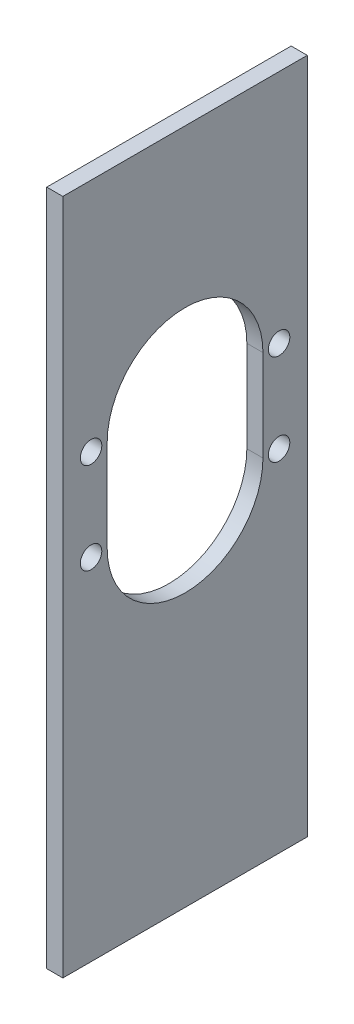
ISO-10303-21;
HEADER;
FILE_DESCRIPTION(('STEP AP214'),'2;1');
FILE_NAME('part.step','',(''),(''),'','','');
FILE_SCHEMA(('AUTOMOTIVE_DESIGN { 1 0 10303 214 1 1 1 1 }'));
ENDSEC;
DATA;
#1=APPLICATION_CONTEXT('core data for automotive mechanical design processes');
#2=APPLICATION_PROTOCOL_DEFINITION('international standard','automotive_design',2000,#1);
#3=PRODUCT_CONTEXT('',#1,'mechanical');
#4=PRODUCT('Part','Part','',(#3));
#5=PRODUCT_RELATED_PRODUCT_CATEGORY('part','',(#4));
#6=PRODUCT_DEFINITION_FORMATION('','',#4);
#7=PRODUCT_DEFINITION_CONTEXT('part definition',#1,'design');
#8=PRODUCT_DEFINITION('design','',#6,#7);
#9=PRODUCT_DEFINITION_SHAPE('','',#8);
#10=(LENGTH_UNIT() NAMED_UNIT(*) SI_UNIT(.MILLI.,.METRE.));
#11=(NAMED_UNIT(*) PLANE_ANGLE_UNIT() SI_UNIT($,.RADIAN.));
#12=(NAMED_UNIT(*) SI_UNIT($,.STERADIAN.) SOLID_ANGLE_UNIT());
#13=UNCERTAINTY_MEASURE_WITH_UNIT(LENGTH_MEASURE(1.E-05),#10,'distance_accuracy_value','');
#14=(GEOMETRIC_REPRESENTATION_CONTEXT(3) GLOBAL_UNCERTAINTY_ASSIGNED_CONTEXT((#13)) GLOBAL_UNIT_ASSIGNED_CONTEXT((#10,
#11,#12)) REPRESENTATION_CONTEXT('',''));
#15=CARTESIAN_POINT('',(0.,0.,0.));
#16=DIRECTION('',(0.,0.,1.));
#17=DIRECTION('',(1.,0.,0.));
#18=AXIS2_PLACEMENT_3D('',#15,#16,#17);
#19=CARTESIAN_POINT('',(3.,0.,0.));
#20=DIRECTION('',(1.,0.,0.));
#21=DIRECTION('',(0.,0.,-1.));
#22=AXIS2_PLACEMENT_3D('',#19,#20,#21);
#23=PLANE('',#22);
#24=CARTESIAN_POINT('',(3.,-43.8,-40.25));
#25=DIRECTION('',(1.,0.,0.));
#26=DIRECTION('',(0.,0.,1.));
#27=AXIS2_PLACEMENT_3D('',#24,#25,#26);
#28=CIRCLE('',#27,2.);
#29=CARTESIAN_POINT('',(3.,-43.8,-38.25));
#30=VERTEX_POINT('',#29);
#31=EDGE_CURVE('E161',#30,#30,#28,.T.);
#32=ORIENTED_EDGE('',*,*,#31,.F.);
#33=EDGE_LOOP('',(#32));
#34=FACE_BOUND('',#33,.T.);
#35=CARTESIAN_POINT('',(3.,-60.8,-5.25));
#36=DIRECTION('',(1.,0.,0.));
#37=DIRECTION('',(0.,0.,-1.));
#38=AXIS2_PLACEMENT_3D('',#35,#36,#37);
#39=CIRCLE('',#38,2.);
#40=CARTESIAN_POINT('',(3.,-60.8,-7.25));
#41=VERTEX_POINT('',#40);
#42=EDGE_CURVE('E177',#41,#41,#39,.T.);
#43=ORIENTED_EDGE('',*,*,#42,.F.);
#44=EDGE_LOOP('',(#43));
#45=FACE_BOUND('',#44,.T.);
#46=DIRECTION('',(0.,-1.,0.));
#47=VECTOR('',#46,1.);
#48=CARTESIAN_POINT('',(3.,0.,0.));
#49=LINE('',#48,#47);
#50=CARTESIAN_POINT('',(3.,0.,0.));
#51=VERTEX_POINT('',#50);
#52=CARTESIAN_POINT('',(3.,-126.,0.));
#53=VERTEX_POINT('',#52);
#54=EDGE_CURVE('E185',#51,#53,#49,.T.);
#55=ORIENTED_EDGE('',*,*,#54,.T.);
#56=DIRECTION('',(0.,0.,-1.));
#57=VECTOR('',#56,1.);
#58=CARTESIAN_POINT('',(3.,-126.,0.));
#59=LINE('',#58,#57);
#60=CARTESIAN_POINT('',(3.,-126.,-45.5));
#61=VERTEX_POINT('',#60);
#62=EDGE_CURVE('E189',#53,#61,#59,.T.);
#63=ORIENTED_EDGE('',*,*,#62,.T.);
#64=DIRECTION('',(0.,1.,0.));
#65=VECTOR('',#64,1.);
#66=CARTESIAN_POINT('',(3.,0.,-45.5));
#67=LINE('',#66,#65);
#68=CARTESIAN_POINT('',(3.,0.,-45.5));
#69=VERTEX_POINT('',#68);
#70=EDGE_CURVE('E193',#61,#69,#67,.T.);
#71=ORIENTED_EDGE('',*,*,#70,.T.);
#72=DIRECTION('',(0.,0.,1.));
#73=VECTOR('',#72,1.);
#74=CARTESIAN_POINT('',(3.,0.,0.));
#75=LINE('',#74,#73);
#76=EDGE_CURVE('E196',#69,#51,#75,.T.);
#77=ORIENTED_EDGE('',*,*,#76,.T.);
#78=EDGE_LOOP('',(#55,#63,#71,#77));
#79=FACE_BOUND('',#78,.T.);
#80=CARTESIAN_POINT('',(3.,-60.8,-40.25));
#81=DIRECTION('',(1.,0.,0.));
#82=DIRECTION('',(0.,0.,-1.));
#83=AXIS2_PLACEMENT_3D('',#80,#81,#82);
#84=CIRCLE('',#83,2.);
#85=CARTESIAN_POINT('',(3.,-60.8,-42.25));
#86=VERTEX_POINT('',#85);
#87=EDGE_CURVE('E169',#86,#86,#84,.T.);
#88=ORIENTED_EDGE('',*,*,#87,.F.);
#89=EDGE_LOOP('',(#88));
#90=FACE_BOUND('',#89,.T.);
#91=CARTESIAN_POINT('',(3.,-43.8,-5.25));
#92=DIRECTION('',(1.,0.,0.));
#93=DIRECTION('',(0.,0.,1.));
#94=AXIS2_PLACEMENT_3D('',#91,#92,#93);
#95=CIRCLE('',#94,2.);
#96=CARTESIAN_POINT('',(3.,-43.8,-3.25));
#97=VERTEX_POINT('',#96);
#98=EDGE_CURVE('E153',#97,#97,#95,.T.);
#99=ORIENTED_EDGE('',*,*,#98,.F.);
#100=EDGE_LOOP('',(#99));
#101=FACE_BOUND('',#100,.T.);
#102=DIRECTION('',(0.,1.,0.));
#103=VECTOR('',#102,1.);
#104=CARTESIAN_POINT('',(3.,-60.8,-37.25));
#105=LINE('',#104,#103);
#106=CARTESIAN_POINT('',(3.,-60.8,-37.25));
#107=VERTEX_POINT('',#106);
#108=CARTESIAN_POINT('',(3.,-43.8,-37.25));
#109=VERTEX_POINT('',#108);
#110=EDGE_CURVE('E114',#107,#109,#105,.T.);
#111=ORIENTED_EDGE('',*,*,#110,.F.);
#112=CARTESIAN_POINT('',(3.,-60.8,-22.75));
#113=DIRECTION('',(1.,0.,0.));
#114=DIRECTION('',(0.,0.,1.));
#115=AXIS2_PLACEMENT_3D('',#112,#113,#114);
#116=CIRCLE('',#115,14.5);
#117=CARTESIAN_POINT('',(3.,-60.8,-8.25));
#118=VERTEX_POINT('',#117);
#119=EDGE_CURVE('E105',#118,#107,#116,.T.);
#120=ORIENTED_EDGE('',*,*,#119,.F.);
#121=DIRECTION('',(0.,-1.,0.));
#122=VECTOR('',#121,1.);
#123=CARTESIAN_POINT('',(3.,-60.8,-8.25));
#124=LINE('',#123,#122);
#125=CARTESIAN_POINT('',(3.,-43.8,-8.25));
#126=VERTEX_POINT('',#125);
#127=EDGE_CURVE('E131',#126,#118,#124,.T.);
#128=ORIENTED_EDGE('',*,*,#127,.F.);
#129=CARTESIAN_POINT('',(3.,-43.8,-22.75));
#130=DIRECTION('',(1.,0.,0.));
#131=DIRECTION('',(0.,0.,-1.));
#132=AXIS2_PLACEMENT_3D('',#129,#130,#131);
#133=CIRCLE('',#132,14.5);
#134=EDGE_CURVE('E127',#109,#126,#133,.T.);
#135=ORIENTED_EDGE('',*,*,#134,.F.);
#136=EDGE_LOOP('',(#111,#120,#128,#135));
#137=FACE_BOUND('',#136,.T.);
#138=ADVANCED_FACE('F39',(#34,#45,#79,#90,#101,#137),#23,.T.);
#139=CARTESIAN_POINT('',(0.,0.,0.));
#140=DIRECTION('',(1.,0.,0.));
#141=DIRECTION('',(0.,0.,-1.));
#142=AXIS2_PLACEMENT_3D('',#139,#140,#141);
#143=PLANE('',#142);
#144=CARTESIAN_POINT('',(0.,-43.8,-5.25));
#145=DIRECTION('',(1.,0.,0.));
#146=DIRECTION('',(0.,0.,1.));
#147=AXIS2_PLACEMENT_3D('',#144,#145,#146);
#148=CIRCLE('',#147,2.);
#149=CARTESIAN_POINT('',(0.,-43.8,-3.25));
#150=VERTEX_POINT('',#149);
#151=EDGE_CURVE('E123',#150,#150,#148,.T.);
#152=ORIENTED_EDGE('',*,*,#151,.T.);
#153=EDGE_LOOP('',(#152));
#154=FACE_BOUND('',#153,.T.);
#155=CARTESIAN_POINT('',(0.,-43.8,-40.25));
#156=DIRECTION('',(1.,0.,0.));
#157=DIRECTION('',(0.,0.,1.));
#158=AXIS2_PLACEMENT_3D('',#155,#156,#157);
#159=CIRCLE('',#158,2.);
#160=CARTESIAN_POINT('',(0.,-43.8,-38.25));
#161=VERTEX_POINT('',#160);
#162=EDGE_CURVE('E157',#161,#161,#159,.T.);
#163=ORIENTED_EDGE('',*,*,#162,.T.);
#164=EDGE_LOOP('',(#163));
#165=FACE_BOUND('',#164,.T.);
#166=CARTESIAN_POINT('',(0.,-60.8,-40.25));
#167=DIRECTION('',(1.,0.,0.));
#168=DIRECTION('',(0.,0.,-1.));
#169=AXIS2_PLACEMENT_3D('',#166,#167,#168);
#170=CIRCLE('',#169,2.);
#171=CARTESIAN_POINT('',(0.,-60.8,-42.25));
#172=VERTEX_POINT('',#171);
#173=EDGE_CURVE('E165',#172,#172,#170,.T.);
#174=ORIENTED_EDGE('',*,*,#173,.T.);
#175=EDGE_LOOP('',(#174));
#176=FACE_BOUND('',#175,.T.);
#177=CARTESIAN_POINT('',(0.,-60.8,-5.25));
#178=DIRECTION('',(1.,0.,0.));
#179=DIRECTION('',(0.,0.,-1.));
#180=AXIS2_PLACEMENT_3D('',#177,#178,#179);
#181=CIRCLE('',#180,2.);
#182=CARTESIAN_POINT('',(0.,-60.8,-7.25));
#183=VERTEX_POINT('',#182);
#184=EDGE_CURVE('E173',#183,#183,#181,.T.);
#185=ORIENTED_EDGE('',*,*,#184,.T.);
#186=EDGE_LOOP('',(#185));
#187=FACE_BOUND('',#186,.T.);
#188=DIRECTION('',(0.,-1.,0.));
#189=VECTOR('',#188,1.);
#190=CARTESIAN_POINT('',(0.,0.,0.));
#191=LINE('',#190,#189);
#192=CARTESIAN_POINT('',(0.,0.,0.));
#193=VERTEX_POINT('',#192);
#194=CARTESIAN_POINT('',(0.,-126.,0.));
#195=VERTEX_POINT('',#194);
#196=EDGE_CURVE('E181',#193,#195,#191,.T.);
#197=ORIENTED_EDGE('',*,*,#196,.F.);
#198=DIRECTION('',(0.,0.,1.));
#199=VECTOR('',#198,1.);
#200=CARTESIAN_POINT('',(0.,0.,0.));
#201=LINE('',#200,#199);
#202=CARTESIAN_POINT('',(0.,0.,-45.5));
#203=VERTEX_POINT('',#202);
#204=EDGE_CURVE('E190',#203,#193,#201,.T.);
#205=ORIENTED_EDGE('',*,*,#204,.F.);
#206=DIRECTION('',(0.,1.,0.));
#207=VECTOR('',#206,1.);
#208=CARTESIAN_POINT('',(0.,0.,-45.5));
#209=LINE('',#208,#207);
#210=CARTESIAN_POINT('',(0.,-126.,-45.5));
#211=VERTEX_POINT('',#210);
#212=EDGE_CURVE('E206',#211,#203,#209,.T.);
#213=ORIENTED_EDGE('',*,*,#212,.F.);
#214=DIRECTION('',(0.,0.,-1.));
#215=VECTOR('',#214,1.);
#216=CARTESIAN_POINT('',(0.,-126.,0.));
#217=LINE('',#216,#215);
#218=EDGE_CURVE('E203',#195,#211,#217,.T.);
#219=ORIENTED_EDGE('',*,*,#218,.F.);
#220=EDGE_LOOP('',(#197,#205,#213,#219));
#221=FACE_BOUND('',#220,.T.);
#222=CARTESIAN_POINT('',(0.,-60.8,-22.75));
#223=DIRECTION('',(1.,0.,0.));
#224=DIRECTION('',(0.,0.,1.));
#225=AXIS2_PLACEMENT_3D('',#222,#223,#224);
#226=CIRCLE('',#225,14.5);
#227=CARTESIAN_POINT('',(0.,-60.8,-8.25));
#228=VERTEX_POINT('',#227);
#229=CARTESIAN_POINT('',(0.,-60.8,-37.25));
#230=VERTEX_POINT('',#229);
#231=EDGE_CURVE('E63',#228,#230,#226,.T.);
#232=ORIENTED_EDGE('',*,*,#231,.T.);
#233=DIRECTION('',(0.,1.,0.));
#234=VECTOR('',#233,1.);
#235=CARTESIAN_POINT('',(0.,-60.8,-37.25));
#236=LINE('',#235,#234);
#237=CARTESIAN_POINT('',(0.,-43.8,-37.25));
#238=VERTEX_POINT('',#237);
#239=EDGE_CURVE('E121',#230,#238,#236,.T.);
#240=ORIENTED_EDGE('',*,*,#239,.T.);
#241=CARTESIAN_POINT('',(0.,-43.8,-22.75));
#242=DIRECTION('',(1.,0.,0.));
#243=DIRECTION('',(0.,0.,-1.));
#244=AXIS2_PLACEMENT_3D('',#241,#242,#243);
#245=CIRCLE('',#244,14.5);
#246=CARTESIAN_POINT('',(0.,-43.8,-8.25));
#247=VERTEX_POINT('',#246);
#248=EDGE_CURVE('E140',#238,#247,#245,.T.);
#249=ORIENTED_EDGE('',*,*,#248,.T.);
#250=DIRECTION('',(0.,-1.,0.));
#251=VECTOR('',#250,1.);
#252=CARTESIAN_POINT('',(0.,-60.8,-8.25));
#253=LINE('',#252,#251);
#254=EDGE_CURVE('E115',#247,#228,#253,.T.);
#255=ORIENTED_EDGE('',*,*,#254,.T.);
#256=EDGE_LOOP('',(#232,#240,#249,#255));
#257=FACE_BOUND('',#256,.T.);
#258=ADVANCED_FACE('F229',(#154,#165,#176,#187,#221,#257),#143,.F.);
#259=CARTESIAN_POINT('',(3.,0.,0.));
#260=DIRECTION('',(0.,0.,-1.));
#261=DIRECTION('',(-1.,0.,0.));
#262=AXIS2_PLACEMENT_3D('',#259,#260,#261);
#263=PLANE('',#262);
#264=ORIENTED_EDGE('',*,*,#196,.T.);
#265=DIRECTION('',(-1.,0.,0.));
#266=VECTOR('',#265,1.);
#267=CARTESIAN_POINT('',(3.,-126.,0.));
#268=LINE('',#267,#266);
#269=EDGE_CURVE('E11',#53,#195,#268,.T.);
#270=ORIENTED_EDGE('',*,*,#269,.F.);
#271=ORIENTED_EDGE('',*,*,#54,.F.);
#272=DIRECTION('',(-1.,0.,0.));
#273=VECTOR('',#272,1.);
#274=CARTESIAN_POINT('',(3.,0.,0.));
#275=LINE('',#274,#273);
#276=EDGE_CURVE('E199',#51,#193,#275,.T.);
#277=ORIENTED_EDGE('',*,*,#276,.T.);
#278=EDGE_LOOP('',(#264,#270,#271,#277));
#279=FACE_BOUND('',#278,.T.);
#280=ADVANCED_FACE('F41',(#279),#263,.F.);
#281=CARTESIAN_POINT('',(3.,-126.,0.));
#282=DIRECTION('',(0.,1.,0.));
#283=DIRECTION('',(0.,0.,1.));
#284=AXIS2_PLACEMENT_3D('',#281,#282,#283);
#285=PLANE('',#284);
#286=ORIENTED_EDGE('',*,*,#218,.T.);
#287=DIRECTION('',(-1.,0.,0.));
#288=VECTOR('',#287,1.);
#289=CARTESIAN_POINT('',(3.,-126.,-45.5));
#290=LINE('',#289,#288);
#291=EDGE_CURVE('E48',#61,#211,#290,.T.);
#292=ORIENTED_EDGE('',*,*,#291,.F.);
#293=ORIENTED_EDGE('',*,*,#62,.F.);
#294=ORIENTED_EDGE('',*,*,#269,.T.);
#295=EDGE_LOOP('',(#286,#292,#293,#294));
#296=FACE_BOUND('',#295,.T.);
#297=ADVANCED_FACE('F240',(#296),#285,.F.);
#298=CARTESIAN_POINT('',(3.,0.,-45.5));
#299=DIRECTION('',(0.,0.,1.));
#300=DIRECTION('',(1.,0.,0.));
#301=AXIS2_PLACEMENT_3D('',#298,#299,#300);
#302=PLANE('',#301);
#303=ORIENTED_EDGE('',*,*,#212,.T.);
#304=DIRECTION('',(-1.,0.,0.));
#305=VECTOR('',#304,1.);
#306=CARTESIAN_POINT('',(3.,0.,-45.5));
#307=LINE('',#306,#305);
#308=EDGE_CURVE('E214',#69,#203,#307,.T.);
#309=ORIENTED_EDGE('',*,*,#308,.F.);
#310=ORIENTED_EDGE('',*,*,#70,.F.);
#311=ORIENTED_EDGE('',*,*,#291,.T.);
#312=EDGE_LOOP('',(#303,#309,#310,#311));
#313=FACE_BOUND('',#312,.T.);
#314=ADVANCED_FACE('F223',(#313),#302,.F.);
#315=CARTESIAN_POINT('',(3.,0.,0.));
#316=DIRECTION('',(0.,-1.,0.));
#317=DIRECTION('',(0.,0.,-1.));
#318=AXIS2_PLACEMENT_3D('',#315,#316,#317);
#319=PLANE('',#318);
#320=ORIENTED_EDGE('',*,*,#204,.T.);
#321=ORIENTED_EDGE('',*,*,#276,.F.);
#322=ORIENTED_EDGE('',*,*,#76,.F.);
#323=ORIENTED_EDGE('',*,*,#308,.T.);
#324=EDGE_LOOP('',(#320,#321,#322,#323));
#325=FACE_BOUND('',#324,.T.);
#326=ADVANCED_FACE('F233',(#325),#319,.F.);
#327=CARTESIAN_POINT('',(3.,-60.8,-5.25));
#328=DIRECTION('',(-1.,0.,0.));
#329=DIRECTION('',(0.,0.,1.));
#330=AXIS2_PLACEMENT_3D('',#327,#328,#329);
#331=CYLINDRICAL_SURFACE('',#330,2.);
#332=ORIENTED_EDGE('',*,*,#42,.T.);
#333=EDGE_LOOP('',(#332));
#334=FACE_BOUND('',#333,.T.);
#335=ORIENTED_EDGE('',*,*,#184,.F.);
#336=EDGE_LOOP('',(#335));
#337=FACE_BOUND('',#336,.T.);
#338=ADVANCED_FACE('F258',(#334,#337),#331,.F.);
#339=CARTESIAN_POINT('',(3.,-60.8,-40.25));
#340=DIRECTION('',(-1.,0.,0.));
#341=DIRECTION('',(0.,0.,1.));
#342=AXIS2_PLACEMENT_3D('',#339,#340,#341);
#343=CYLINDRICAL_SURFACE('',#342,2.);
#344=ORIENTED_EDGE('',*,*,#87,.T.);
#345=EDGE_LOOP('',(#344));
#346=FACE_BOUND('',#345,.T.);
#347=ORIENTED_EDGE('',*,*,#173,.F.);
#348=EDGE_LOOP('',(#347));
#349=FACE_BOUND('',#348,.T.);
#350=ADVANCED_FACE('F265',(#346,#349),#343,.F.);
#351=CARTESIAN_POINT('',(3.,-43.8,-40.25));
#352=DIRECTION('',(-1.,0.,0.));
#353=DIRECTION('',(0.,0.,1.));
#354=AXIS2_PLACEMENT_3D('',#351,#352,#353);
#355=CYLINDRICAL_SURFACE('',#354,2.);
#356=ORIENTED_EDGE('',*,*,#31,.T.);
#357=EDGE_LOOP('',(#356));
#358=FACE_BOUND('',#357,.T.);
#359=ORIENTED_EDGE('',*,*,#162,.F.);
#360=EDGE_LOOP('',(#359));
#361=FACE_BOUND('',#360,.T.);
#362=ADVANCED_FACE('F270',(#358,#361),#355,.F.);
#363=CARTESIAN_POINT('',(3.,-43.8,-5.25));
#364=DIRECTION('',(-1.,0.,0.));
#365=DIRECTION('',(0.,0.,1.));
#366=AXIS2_PLACEMENT_3D('',#363,#364,#365);
#367=CYLINDRICAL_SURFACE('',#366,2.);
#368=ORIENTED_EDGE('',*,*,#98,.T.);
#369=EDGE_LOOP('',(#368));
#370=FACE_BOUND('',#369,.T.);
#371=ORIENTED_EDGE('',*,*,#151,.F.);
#372=EDGE_LOOP('',(#371));
#373=FACE_BOUND('',#372,.T.);
#374=ADVANCED_FACE('F279',(#370,#373),#367,.F.);
#375=CARTESIAN_POINT('',(3.,-60.8,-22.75));
#376=DIRECTION('',(-1.,0.,0.));
#377=DIRECTION('',(0.,0.,1.));
#378=AXIS2_PLACEMENT_3D('',#375,#376,#377);
#379=CYLINDRICAL_SURFACE('',#378,14.5);
#380=ORIENTED_EDGE('',*,*,#231,.F.);
#381=DIRECTION('',(-1.,0.,0.));
#382=VECTOR('',#381,1.);
#383=CARTESIAN_POINT('',(3.,-60.8,-8.25));
#384=LINE('',#383,#382);
#385=EDGE_CURVE('E109',#118,#228,#384,.T.);
#386=ORIENTED_EDGE('',*,*,#385,.F.);
#387=ORIENTED_EDGE('',*,*,#119,.T.);
#388=DIRECTION('',(-1.,0.,0.));
#389=VECTOR('',#388,1.);
#390=CARTESIAN_POINT('',(3.,-60.8,-37.25));
#391=LINE('',#390,#389);
#392=EDGE_CURVE('E108',#107,#230,#391,.T.);
#393=ORIENTED_EDGE('',*,*,#392,.T.);
#394=EDGE_LOOP('',(#380,#386,#387,#393));
#395=FACE_BOUND('',#394,.T.);
#396=ADVANCED_FACE('F107',(#395),#379,.F.);
#397=CARTESIAN_POINT('',(3.,-60.8,-37.25));
#398=DIRECTION('',(0.,0.,1.));
#399=DIRECTION('',(0.,-1.,0.));
#400=AXIS2_PLACEMENT_3D('',#397,#398,#399);
#401=PLANE('',#400);
#402=ORIENTED_EDGE('',*,*,#239,.F.);
#403=ORIENTED_EDGE('',*,*,#392,.F.);
#404=ORIENTED_EDGE('',*,*,#110,.T.);
#405=DIRECTION('',(-1.,0.,0.));
#406=VECTOR('',#405,1.);
#407=CARTESIAN_POINT('',(3.,-43.8,-37.25));
#408=LINE('',#407,#406);
#409=EDGE_CURVE('E124',#109,#238,#408,.T.);
#410=ORIENTED_EDGE('',*,*,#409,.T.);
#411=EDGE_LOOP('',(#402,#403,#404,#410));
#412=FACE_BOUND('',#411,.T.);
#413=ADVANCED_FACE('F118',(#412),#401,.T.);
#414=CARTESIAN_POINT('',(3.,-43.8,-22.75));
#415=DIRECTION('',(-1.,0.,0.));
#416=DIRECTION('',(0.,0.,1.));
#417=AXIS2_PLACEMENT_3D('',#414,#415,#416);
#418=CYLINDRICAL_SURFACE('',#417,14.5);
#419=ORIENTED_EDGE('',*,*,#248,.F.);
#420=ORIENTED_EDGE('',*,*,#409,.F.);
#421=ORIENTED_EDGE('',*,*,#134,.T.);
#422=DIRECTION('',(-1.,0.,0.));
#423=VECTOR('',#422,1.);
#424=CARTESIAN_POINT('',(3.,-43.8,-8.25));
#425=LINE('',#424,#423);
#426=EDGE_CURVE('E55',#126,#247,#425,.T.);
#427=ORIENTED_EDGE('',*,*,#426,.T.);
#428=EDGE_LOOP('',(#419,#420,#421,#427));
#429=FACE_BOUND('',#428,.T.);
#430=ADVANCED_FACE('F291',(#429),#418,.F.);
#431=CARTESIAN_POINT('',(3.,-60.8,-8.25));
#432=DIRECTION('',(0.,0.,-1.));
#433=DIRECTION('',(-1.,0.,0.));
#434=AXIS2_PLACEMENT_3D('',#431,#432,#433);
#435=PLANE('',#434);
#436=ORIENTED_EDGE('',*,*,#254,.F.);
#437=ORIENTED_EDGE('',*,*,#426,.F.);
#438=ORIENTED_EDGE('',*,*,#127,.T.);
#439=ORIENTED_EDGE('',*,*,#385,.T.);
#440=EDGE_LOOP('',(#436,#437,#438,#439));
#441=FACE_BOUND('',#440,.T.);
#442=ADVANCED_FACE('F294',(#441),#435,.T.);
#443=CLOSED_SHELL('',(#138,#258,#280,#297,#314,#326,#338,#350,#362,#374,#396,#413,#430,#442));
#444=MANIFOLD_SOLID_BREP('B2',#443);
#445=ADVANCED_BREP_SHAPE_REPRESENTATION('',(#18,#444),#14);
#446=SHAPE_DEFINITION_REPRESENTATION(#9,#445);
ENDSEC;
END-ISO-10303-21;
